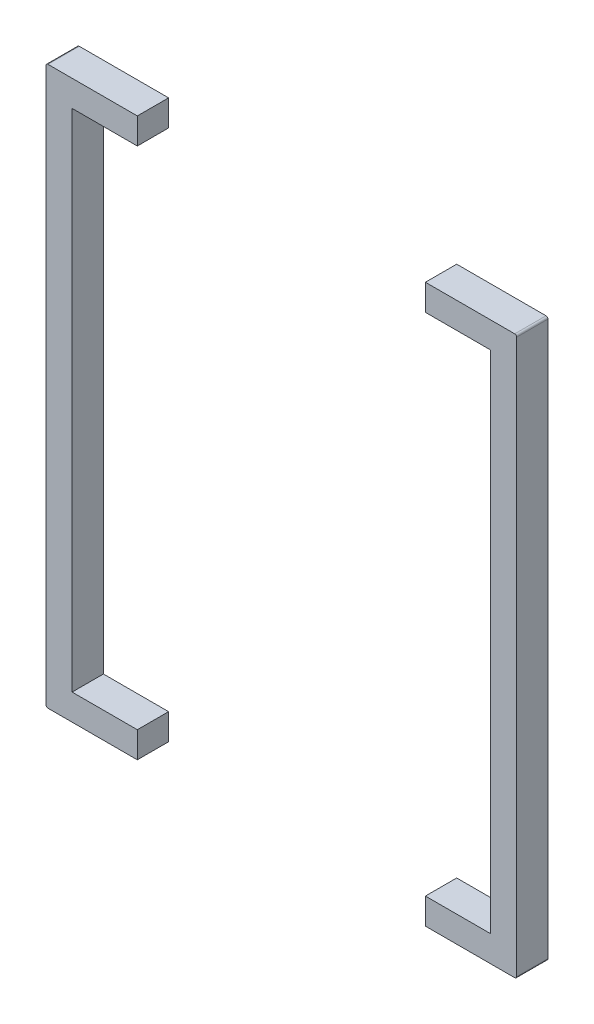
ISO-10303-21;
HEADER;
FILE_DESCRIPTION(('STEP AP214'),'2;1');
FILE_NAME('part.step','',(''),(''),'','','');
FILE_SCHEMA(('AUTOMOTIVE_DESIGN { 1 0 10303 214 1 1 1 1 }'));
ENDSEC;
DATA;
#1=APPLICATION_CONTEXT('core data for automotive mechanical design processes');
#2=APPLICATION_PROTOCOL_DEFINITION('international standard','automotive_design',2000,#1);
#3=PRODUCT_CONTEXT('',#1,'mechanical');
#4=PRODUCT('Part','Part','',(#3));
#5=PRODUCT_RELATED_PRODUCT_CATEGORY('part','',(#4));
#6=PRODUCT_DEFINITION_FORMATION('','',#4);
#7=PRODUCT_DEFINITION_CONTEXT('part definition',#1,'design');
#8=PRODUCT_DEFINITION('design','',#6,#7);
#9=PRODUCT_DEFINITION_SHAPE('','',#8);
#10=(LENGTH_UNIT() NAMED_UNIT(*) SI_UNIT(.MILLI.,.METRE.));
#11=(NAMED_UNIT(*) PLANE_ANGLE_UNIT() SI_UNIT($,.RADIAN.));
#12=(NAMED_UNIT(*) SI_UNIT($,.STERADIAN.) SOLID_ANGLE_UNIT());
#13=UNCERTAINTY_MEASURE_WITH_UNIT(LENGTH_MEASURE(1.E-05),#10,'distance_accuracy_value','');
#14=(GEOMETRIC_REPRESENTATION_CONTEXT(3) GLOBAL_UNCERTAINTY_ASSIGNED_CONTEXT((#13)) GLOBAL_UNIT_ASSIGNED_CONTEXT((#10,
#11,#12)) REPRESENTATION_CONTEXT('',''));
#15=CARTESIAN_POINT('',(0.,0.,0.));
#16=DIRECTION('',(0.,0.,1.));
#17=DIRECTION('',(1.,0.,0.));
#18=AXIS2_PLACEMENT_3D('',#15,#16,#17);
#19=CARTESIAN_POINT('',(-76.1520295904938,8.24310096287703,12.));
#20=DIRECTION('',(0.,1.,0.));
#21=DIRECTION('',(0.,0.,1.));
#22=AXIS2_PLACEMENT_3D('',#19,#20,#21);
#23=PLANE('',#22);
#24=DIRECTION('',(1.,0.,0.));
#25=VECTOR('',#24,1.);
#26=CARTESIAN_POINT('',(-76.1520295904938,8.24310096287703,12.));
#27=LINE('',#26,#25);
#28=CARTESIAN_POINT('',(69.3179704095062,8.24310096287703,12.));
#29=VERTEX_POINT('',#28);
#30=CARTESIAN_POINT('',(103.581370409506,8.24310096287703,12.));
#31=VERTEX_POINT('',#30);
#32=EDGE_CURVE('E124',#29,#31,#27,.T.);
#33=ORIENTED_EDGE('',*,*,#32,.F.);
#34=DIRECTION('',(0.,0.,1.));
#35=VECTOR('',#34,1.);
#36=CARTESIAN_POINT('',(69.3179704095062,8.24310096287703,12.));
#37=LINE('',#36,#35);
#38=CARTESIAN_POINT('',(69.3179704095062,8.24310096287703,0.));
#39=VERTEX_POINT('',#38);
#40=EDGE_CURVE('E12',#39,#29,#37,.T.);
#41=ORIENTED_EDGE('',*,*,#40,.F.);
#42=DIRECTION('',(1.,0.,0.));
#43=VECTOR('',#42,1.);
#44=CARTESIAN_POINT('',(-76.1520295904938,8.24310096287703,0.));
#45=LINE('',#44,#43);
#46=CARTESIAN_POINT('',(103.581370409506,8.24310096287703,0.));
#47=VERTEX_POINT('',#46);
#48=EDGE_CURVE('E122',#39,#47,#45,.T.);
#49=ORIENTED_EDGE('',*,*,#48,.T.);
#50=DIRECTION('',(0.,0.,-1.));
#51=VECTOR('',#50,1.);
#52=CARTESIAN_POINT('',(103.581370409506,8.24310096287703,12.));
#53=LINE('',#52,#51);
#54=EDGE_CURVE('E129',#47,#31,#53,.F.);
#55=ORIENTED_EDGE('',*,*,#54,.T.);
#56=EDGE_LOOP('',(#33,#41,#49,#55));
#57=FACE_BOUND('',#56,.T.);
#58=ADVANCED_FACE('F40',(#57),#23,.F.);
#59=CARTESIAN_POINT('',(-76.1520295904938,8.24310096287703,12.));
#60=DIRECTION('',(0.,0.,1.));
#61=DIRECTION('',(1.,0.,0.));
#62=AXIS2_PLACEMENT_3D('',#59,#60,#61);
#63=PLANE('',#62);
#64=DIRECTION('',(0.,-1.,0.));
#65=VECTOR('',#64,1.);
#66=CARTESIAN_POINT('',(69.3179704095062,222.084100962877,12.));
#67=LINE('',#66,#65);
#68=CARTESIAN_POINT('',(69.3179704095062,18.243100962877,12.));
#69=VERTEX_POINT('',#68);
#70=EDGE_CURVE('E56',#69,#29,#67,.T.);
#71=ORIENTED_EDGE('',*,*,#70,.T.);
#72=ORIENTED_EDGE('',*,*,#32,.T.);
#73=CARTESIAN_POINT('',(103.581370409506,8.97970096287704,12.));
#74=DIRECTION('',(0.,0.,1.));
#75=DIRECTION('',(1.,0.,0.));
#76=AXIS2_PLACEMENT_3D('',#73,#74,#75);
#77=CIRCLE('',#76,0.7366);
#78=CARTESIAN_POINT('',(104.317970409506,8.97970096287709,12.));
#79=VERTEX_POINT('',#78);
#80=EDGE_CURVE('E165',#31,#79,#77,.T.);
#81=ORIENTED_EDGE('',*,*,#80,.T.);
#82=DIRECTION('',(0.,1.,0.));
#83=VECTOR('',#82,1.);
#84=CARTESIAN_POINT('',(104.317970409506,222.083100962877,12.));
#85=LINE('',#84,#83);
#86=CARTESIAN_POINT('',(104.317970409506,221.346500962877,12.));
#87=VERTEX_POINT('',#86);
#88=EDGE_CURVE('E162',#79,#87,#85,.T.);
#89=ORIENTED_EDGE('',*,*,#88,.T.);
#90=CARTESIAN_POINT('',(103.581370409506,221.346500962877,12.));
#91=DIRECTION('',(0.,0.,1.));
#92=DIRECTION('',(1.,0.,0.));
#93=AXIS2_PLACEMENT_3D('',#90,#91,#92);
#94=CIRCLE('',#93,0.7366);
#95=CARTESIAN_POINT('',(103.581370409506,222.083100962877,12.));
#96=VERTEX_POINT('',#95);
#97=EDGE_CURVE('E164',#87,#96,#94,.T.);
#98=ORIENTED_EDGE('',*,*,#97,.T.);
#99=DIRECTION('',(-1.,0.,0.));
#100=VECTOR('',#99,1.);
#101=CARTESIAN_POINT('',(-76.1520295904938,222.083100962877,12.));
#102=LINE('',#101,#100);
#103=CARTESIAN_POINT('',(69.3179704095062,222.083100962877,12.));
#104=VERTEX_POINT('',#103);
#105=EDGE_CURVE('E179',#96,#104,#102,.T.);
#106=ORIENTED_EDGE('',*,*,#105,.T.);
#107=DIRECTION('',(0.,1.,0.));
#108=VECTOR('',#107,1.);
#109=CARTESIAN_POINT('',(69.3179704095062,8.24210096287703,12.));
#110=LINE('',#109,#108);
#111=CARTESIAN_POINT('',(69.3179704095062,212.083100962877,12.));
#112=VERTEX_POINT('',#111);
#113=EDGE_CURVE('E180',#112,#104,#110,.T.);
#114=ORIENTED_EDGE('',*,*,#113,.F.);
#115=DIRECTION('',(-1.,0.,0.));
#116=VECTOR('',#115,1.);
#117=CARTESIAN_POINT('',(-66.1520295904938,212.083100962877,12.));
#118=LINE('',#117,#116);
#119=CARTESIAN_POINT('',(94.3179704095062,212.083100962877,12.));
#120=VERTEX_POINT('',#119);
#121=EDGE_CURVE('E139',#120,#112,#118,.T.);
#122=ORIENTED_EDGE('',*,*,#121,.F.);
#123=DIRECTION('',(0.,1.,0.));
#124=VECTOR('',#123,1.);
#125=CARTESIAN_POINT('',(94.3179704095062,212.083100962877,12.));
#126=LINE('',#125,#124);
#127=CARTESIAN_POINT('',(94.3179704095062,18.243100962877,12.));
#128=VERTEX_POINT('',#127);
#129=EDGE_CURVE('E168',#128,#120,#126,.T.);
#130=ORIENTED_EDGE('',*,*,#129,.F.);
#131=DIRECTION('',(1.,0.,0.));
#132=VECTOR('',#131,1.);
#133=CARTESIAN_POINT('',(-66.1520295904938,18.243100962877,12.));
#134=LINE('',#133,#132);
#135=EDGE_CURVE('E138',#69,#128,#134,.T.);
#136=ORIENTED_EDGE('',*,*,#135,.F.);
#137=EDGE_LOOP('',(#71,#72,#81,#89,#98,#106,#114,#122,#130,#136));
#138=FACE_BOUND('',#137,.T.);
#139=ADVANCED_FACE('F205',(#138),#63,.T.);
#140=CARTESIAN_POINT('',(-76.1520295904938,8.24310096287703,0.));
#141=DIRECTION('',(0.,0.,1.));
#142=DIRECTION('',(1.,0.,0.));
#143=AXIS2_PLACEMENT_3D('',#140,#141,#142);
#144=PLANE('',#143);
#145=ORIENTED_EDGE('',*,*,#48,.F.);
#146=DIRECTION('',(0.,-1.,0.));
#147=VECTOR('',#146,1.);
#148=CARTESIAN_POINT('',(69.3179704095062,222.084100962877,0.));
#149=LINE('',#148,#147);
#150=CARTESIAN_POINT('',(69.3179704095062,18.243100962877,0.));
#151=VERTEX_POINT('',#150);
#152=EDGE_CURVE('E49',#151,#39,#149,.T.);
#153=ORIENTED_EDGE('',*,*,#152,.F.);
#154=DIRECTION('',(-1.,0.,0.));
#155=VECTOR('',#154,1.);
#156=CARTESIAN_POINT('',(-66.1520295904938,18.243100962877,0.));
#157=LINE('',#156,#155);
#158=CARTESIAN_POINT('',(94.3179704095062,18.243100962877,0.));
#159=VERTEX_POINT('',#158);
#160=EDGE_CURVE('E136',#159,#151,#157,.T.);
#161=ORIENTED_EDGE('',*,*,#160,.F.);
#162=DIRECTION('',(0.,-1.,0.));
#163=VECTOR('',#162,1.);
#164=CARTESIAN_POINT('',(94.3179704095062,212.083100962877,0.));
#165=LINE('',#164,#163);
#166=CARTESIAN_POINT('',(94.3179704095062,212.083100962877,0.));
#167=VERTEX_POINT('',#166);
#168=EDGE_CURVE('E169',#167,#159,#165,.T.);
#169=ORIENTED_EDGE('',*,*,#168,.F.);
#170=DIRECTION('',(1.,0.,0.));
#171=VECTOR('',#170,1.);
#172=CARTESIAN_POINT('',(-66.1520295904938,212.083100962877,0.));
#173=LINE('',#172,#171);
#174=CARTESIAN_POINT('',(69.3179704095062,212.083100962877,0.));
#175=VERTEX_POINT('',#174);
#176=EDGE_CURVE('E43',#175,#167,#173,.T.);
#177=ORIENTED_EDGE('',*,*,#176,.F.);
#178=DIRECTION('',(0.,1.,0.));
#179=VECTOR('',#178,1.);
#180=CARTESIAN_POINT('',(69.3179704095062,8.24210096287703,0.));
#181=LINE('',#180,#179);
#182=CARTESIAN_POINT('',(69.3179704095062,222.083100962877,0.));
#183=VERTEX_POINT('',#182);
#184=EDGE_CURVE('E176',#175,#183,#181,.T.);
#185=ORIENTED_EDGE('',*,*,#184,.T.);
#186=DIRECTION('',(-1.,0.,0.));
#187=VECTOR('',#186,1.);
#188=CARTESIAN_POINT('',(-76.1520295904938,222.083100962877,0.));
#189=LINE('',#188,#187);
#190=CARTESIAN_POINT('',(103.581370409506,222.083100962877,0.));
#191=VERTEX_POINT('',#190);
#192=EDGE_CURVE('E134',#191,#183,#189,.T.);
#193=ORIENTED_EDGE('',*,*,#192,.F.);
#194=CARTESIAN_POINT('',(103.581370409506,221.346500962877,0.));
#195=DIRECTION('',(0.,0.,1.));
#196=DIRECTION('',(1.,0.,0.));
#197=AXIS2_PLACEMENT_3D('',#194,#195,#196);
#198=CIRCLE('',#197,0.7366);
#199=CARTESIAN_POINT('',(104.317970409506,221.346500962877,0.));
#200=VERTEX_POINT('',#199);
#201=EDGE_CURVE('E156',#191,#200,#198,.F.);
#202=ORIENTED_EDGE('',*,*,#201,.T.);
#203=DIRECTION('',(0.,1.,0.));
#204=VECTOR('',#203,1.);
#205=CARTESIAN_POINT('',(104.317970409506,222.083100962877,0.));
#206=LINE('',#205,#204);
#207=CARTESIAN_POINT('',(104.317970409506,8.97970096287709,0.));
#208=VERTEX_POINT('',#207);
#209=EDGE_CURVE('E158',#208,#200,#206,.T.);
#210=ORIENTED_EDGE('',*,*,#209,.F.);
#211=CARTESIAN_POINT('',(103.581370409506,8.97970096287704,0.));
#212=DIRECTION('',(0.,0.,1.));
#213=DIRECTION('',(1.,0.,0.));
#214=AXIS2_PLACEMENT_3D('',#211,#212,#213);
#215=CIRCLE('',#214,0.7366);
#216=EDGE_CURVE('E127',#208,#47,#215,.F.);
#217=ORIENTED_EDGE('',*,*,#216,.T.);
#218=EDGE_LOOP('',(#145,#153,#161,#169,#177,#185,#193,#202,#210,#217));
#219=FACE_BOUND('',#218,.T.);
#220=ADVANCED_FACE('F125',(#219),#144,.F.);
#221=CARTESIAN_POINT('',(-66.1520295904938,18.243100962877,-0.000999999999999265));
#222=DIRECTION('',(0.,-1.,0.));
#223=DIRECTION('',(0.,0.,-1.));
#224=AXIS2_PLACEMENT_3D('',#221,#222,#223);
#225=PLANE('',#224);
#226=ORIENTED_EDGE('',*,*,#160,.T.);
#227=DIRECTION('',(0.,0.,-1.));
#228=VECTOR('',#227,1.);
#229=CARTESIAN_POINT('',(69.3179704095062,18.243100962877,12.));
#230=LINE('',#229,#228);
#231=EDGE_CURVE('E113',#69,#151,#230,.T.);
#232=ORIENTED_EDGE('',*,*,#231,.F.);
#233=ORIENTED_EDGE('',*,*,#135,.T.);
#234=DIRECTION('',(0.,0.,1.));
#235=VECTOR('',#234,1.);
#236=CARTESIAN_POINT('',(94.3179704095062,18.243100962877,-0.000999999999999265));
#237=LINE('',#236,#235);
#238=EDGE_CURVE('E166',#159,#128,#237,.T.);
#239=ORIENTED_EDGE('',*,*,#238,.F.);
#240=EDGE_LOOP('',(#226,#232,#233,#239));
#241=FACE_BOUND('',#240,.T.);
#242=ADVANCED_FACE('F220',(#241),#225,.F.);
#243=CARTESIAN_POINT('',(-76.1520295904938,222.083100962877,12.));
#244=DIRECTION('',(0.,-1.,0.));
#245=DIRECTION('',(0.,0.,-1.));
#246=AXIS2_PLACEMENT_3D('',#243,#244,#245);
#247=PLANE('',#246);
#248=ORIENTED_EDGE('',*,*,#192,.T.);
#249=DIRECTION('',(0.,0.,-1.));
#250=VECTOR('',#249,1.);
#251=CARTESIAN_POINT('',(69.3179704095062,222.083100962877,0.));
#252=LINE('',#251,#250);
#253=EDGE_CURVE('E182',#104,#183,#252,.T.);
#254=ORIENTED_EDGE('',*,*,#253,.F.);
#255=ORIENTED_EDGE('',*,*,#105,.F.);
#256=DIRECTION('',(0.,0.,-1.));
#257=VECTOR('',#256,1.);
#258=CARTESIAN_POINT('',(103.581370409506,222.083100962877,12.));
#259=LINE('',#258,#257);
#260=EDGE_CURVE('E141',#96,#191,#259,.T.);
#261=ORIENTED_EDGE('',*,*,#260,.T.);
#262=EDGE_LOOP('',(#248,#254,#255,#261));
#263=FACE_BOUND('',#262,.T.);
#264=ADVANCED_FACE('F207',(#263),#247,.F.);
#265=CARTESIAN_POINT('',(-66.1520295904938,212.083100962877,-0.000999999999999265));
#266=DIRECTION('',(0.,1.,0.));
#267=DIRECTION('',(0.,0.,1.));
#268=AXIS2_PLACEMENT_3D('',#265,#266,#267);
#269=PLANE('',#268);
#270=ORIENTED_EDGE('',*,*,#121,.T.);
#271=DIRECTION('',(0.,0.,1.));
#272=VECTOR('',#271,1.);
#273=CARTESIAN_POINT('',(69.3179704095062,212.083100962877,0.));
#274=LINE('',#273,#272);
#275=EDGE_CURVE('E174',#175,#112,#274,.T.);
#276=ORIENTED_EDGE('',*,*,#275,.F.);
#277=ORIENTED_EDGE('',*,*,#176,.T.);
#278=DIRECTION('',(0.,0.,1.));
#279=VECTOR('',#278,1.);
#280=CARTESIAN_POINT('',(94.3179704095062,212.083100962877,-0.000999999999999265));
#281=LINE('',#280,#279);
#282=EDGE_CURVE('E170',#167,#120,#281,.T.);
#283=ORIENTED_EDGE('',*,*,#282,.T.);
#284=EDGE_LOOP('',(#270,#276,#277,#283));
#285=FACE_BOUND('',#284,.T.);
#286=ADVANCED_FACE('F215',(#285),#269,.F.);
#287=CARTESIAN_POINT('',(104.317970409506,222.083100962877,12.));
#288=DIRECTION('',(-1.,0.,0.));
#289=DIRECTION('',(0.,-1.,0.));
#290=AXIS2_PLACEMENT_3D('',#287,#288,#289);
#291=PLANE('',#290);
#292=ORIENTED_EDGE('',*,*,#88,.F.);
#293=DIRECTION('',(0.,0.,-1.));
#294=VECTOR('',#293,1.);
#295=CARTESIAN_POINT('',(104.317970409506,8.97970096287704,12.));
#296=LINE('',#295,#294);
#297=EDGE_CURVE('E161',#79,#208,#296,.T.);
#298=ORIENTED_EDGE('',*,*,#297,.T.);
#299=ORIENTED_EDGE('',*,*,#209,.T.);
#300=DIRECTION('',(0.,0.,-1.));
#301=VECTOR('',#300,1.);
#302=CARTESIAN_POINT('',(104.317970409506,221.346500962877,12.));
#303=LINE('',#302,#301);
#304=EDGE_CURVE('E160',#200,#87,#303,.F.);
#305=ORIENTED_EDGE('',*,*,#304,.T.);
#306=EDGE_LOOP('',(#292,#298,#299,#305));
#307=FACE_BOUND('',#306,.T.);
#308=ADVANCED_FACE('F200',(#307),#291,.F.);
#309=CARTESIAN_POINT('',(103.581370409506,221.346500962877,12.));
#310=DIRECTION('',(0.,0.,-1.));
#311=DIRECTION('',(-1.,0.,0.));
#312=AXIS2_PLACEMENT_3D('',#309,#310,#311);
#313=CYLINDRICAL_SURFACE('',#312,0.7366);
#314=ORIENTED_EDGE('',*,*,#97,.F.);
#315=ORIENTED_EDGE('',*,*,#304,.F.);
#316=ORIENTED_EDGE('',*,*,#201,.F.);
#317=ORIENTED_EDGE('',*,*,#260,.F.);
#318=EDGE_LOOP('',(#314,#315,#316,#317));
#319=FACE_BOUND('',#318,.T.);
#320=ADVANCED_FACE('F204',(#319),#313,.T.);
#321=CARTESIAN_POINT('',(103.581370409506,8.97970096287704,12.));
#322=DIRECTION('',(0.,0.,-1.));
#323=DIRECTION('',(-1.,0.,0.));
#324=AXIS2_PLACEMENT_3D('',#321,#322,#323);
#325=CYLINDRICAL_SURFACE('',#324,0.7366);
#326=ORIENTED_EDGE('',*,*,#80,.F.);
#327=ORIENTED_EDGE('',*,*,#54,.F.);
#328=ORIENTED_EDGE('',*,*,#216,.F.);
#329=ORIENTED_EDGE('',*,*,#297,.F.);
#330=EDGE_LOOP('',(#326,#327,#328,#329));
#331=FACE_BOUND('',#330,.T.);
#332=ADVANCED_FACE('F274',(#331),#325,.T.);
#333=CARTESIAN_POINT('',(94.3179704095062,212.083100962877,-0.000999999999999265));
#334=DIRECTION('',(1.,0.,0.));
#335=DIRECTION('',(0.,1.,0.));
#336=AXIS2_PLACEMENT_3D('',#333,#334,#335);
#337=PLANE('',#336);
#338=ORIENTED_EDGE('',*,*,#168,.T.);
#339=ORIENTED_EDGE('',*,*,#238,.T.);
#340=ORIENTED_EDGE('',*,*,#129,.T.);
#341=ORIENTED_EDGE('',*,*,#282,.F.);
#342=EDGE_LOOP('',(#338,#339,#340,#341));
#343=FACE_BOUND('',#342,.T.);
#344=ADVANCED_FACE('F217',(#343),#337,.F.);
#345=CARTESIAN_POINT('',(69.3179704095062,8.24210096287703,0.));
#346=DIRECTION('',(1.,0.,0.));
#347=DIRECTION('',(0.,0.,-1.));
#348=AXIS2_PLACEMENT_3D('',#345,#346,#347);
#349=PLANE('',#348);
#350=ORIENTED_EDGE('',*,*,#275,.T.);
#351=ORIENTED_EDGE('',*,*,#113,.T.);
#352=ORIENTED_EDGE('',*,*,#253,.T.);
#353=ORIENTED_EDGE('',*,*,#184,.F.);
#354=EDGE_LOOP('',(#350,#351,#352,#353));
#355=FACE_BOUND('',#354,.T.);
#356=ADVANCED_FACE('F209',(#355),#349,.F.);
#357=CARTESIAN_POINT('',(69.3179704095062,222.084100962877,12.));
#358=DIRECTION('',(1.,0.,0.));
#359=DIRECTION('',(0.,0.,-1.));
#360=AXIS2_PLACEMENT_3D('',#357,#358,#359);
#361=PLANE('',#360);
#362=ORIENTED_EDGE('',*,*,#231,.T.);
#363=ORIENTED_EDGE('',*,*,#152,.T.);
#364=ORIENTED_EDGE('',*,*,#40,.T.);
#365=ORIENTED_EDGE('',*,*,#70,.F.);
#366=EDGE_LOOP('',(#362,#363,#364,#365));
#367=FACE_BOUND('',#366,.T.);
#368=ADVANCED_FACE('F112',(#367),#361,.F.);
#369=CLOSED_SHELL('',(#58,#139,#220,#242,#264,#286,#308,#320,#332,#344,#356,#368));
#370=MANIFOLD_SOLID_BREP('B2',#369);
#371=CARTESIAN_POINT('',(-66.1520295904938,212.083100962877,-0.000999999999999265));
#372=DIRECTION('',(0.,1.,0.));
#373=DIRECTION('',(0.,0.,1.));
#374=AXIS2_PLACEMENT_3D('',#371,#372,#373);
#375=PLANE('',#374);
#376=DIRECTION('',(1.,0.,0.));
#377=VECTOR('',#376,1.);
#378=CARTESIAN_POINT('',(-66.1520295904938,212.083100962877,0.));
#379=LINE('',#378,#377);
#380=CARTESIAN_POINT('',(-66.1520295904938,212.083100962877,0.));
#381=VERTEX_POINT('',#380);
#382=CARTESIAN_POINT('',(-41.1520295904938,212.083100962877,0.));
#383=VERTEX_POINT('',#382);
#384=EDGE_CURVE('E473',#381,#383,#379,.T.);
#385=ORIENTED_EDGE('',*,*,#384,.T.);
#386=DIRECTION('',(0.,0.,-1.));
#387=VECTOR('',#386,1.);
#388=CARTESIAN_POINT('',(-41.1520295904938,212.083100962877,0.));
#389=LINE('',#388,#387);
#390=CARTESIAN_POINT('',(-41.1520295904938,212.083100962877,12.));
#391=VERTEX_POINT('',#390);
#392=EDGE_CURVE('E464',#391,#383,#389,.T.);
#393=ORIENTED_EDGE('',*,*,#392,.F.);
#394=DIRECTION('',(-1.,0.,0.));
#395=VECTOR('',#394,1.);
#396=CARTESIAN_POINT('',(-66.1520295904938,212.083100962877,12.));
#397=LINE('',#396,#395);
#398=CARTESIAN_POINT('',(-66.1520295904938,212.083100962877,12.));
#399=VERTEX_POINT('',#398);
#400=EDGE_CURVE('E484',#391,#399,#397,.T.);
#401=ORIENTED_EDGE('',*,*,#400,.T.);
#402=DIRECTION('',(0.,0.,1.));
#403=VECTOR('',#402,1.);
#404=CARTESIAN_POINT('',(-66.1520295904938,212.083100962877,-0.000999999999999265));
#405=LINE('',#404,#403);
#406=EDGE_CURVE('E487',#381,#399,#405,.T.);
#407=ORIENTED_EDGE('',*,*,#406,.F.);
#408=EDGE_LOOP('',(#385,#393,#401,#407));
#409=FACE_BOUND('',#408,.T.);
#410=ADVANCED_FACE('F319',(#409),#375,.F.);
#411=CARTESIAN_POINT('',(-41.1520295904938,8.24210096287703,0.));
#412=DIRECTION('',(-1.,0.,0.));
#413=DIRECTION('',(0.,0.,1.));
#414=AXIS2_PLACEMENT_3D('',#411,#412,#413);
#415=PLANE('',#414);
#416=ORIENTED_EDGE('',*,*,#392,.T.);
#417=DIRECTION('',(0.,1.,0.));
#418=VECTOR('',#417,1.);
#419=CARTESIAN_POINT('',(-41.1520295904938,8.24210096287703,0.));
#420=LINE('',#419,#418);
#421=CARTESIAN_POINT('',(-41.1520295904938,222.083100962877,0.));
#422=VERTEX_POINT('',#421);
#423=EDGE_CURVE('E471',#383,#422,#420,.T.);
#424=ORIENTED_EDGE('',*,*,#423,.T.);
#425=DIRECTION('',(0.,0.,1.));
#426=VECTOR('',#425,1.);
#427=CARTESIAN_POINT('',(-41.1520295904938,222.083100962877,0.));
#428=LINE('',#427,#426);
#429=CARTESIAN_POINT('',(-41.1520295904938,222.083100962877,12.));
#430=VERTEX_POINT('',#429);
#431=EDGE_CURVE('E466',#422,#430,#428,.T.);
#432=ORIENTED_EDGE('',*,*,#431,.T.);
#433=DIRECTION('',(0.,1.,0.));
#434=VECTOR('',#433,1.);
#435=CARTESIAN_POINT('',(-41.1520295904938,8.24210096287703,12.));
#436=LINE('',#435,#434);
#437=EDGE_CURVE('E342',#391,#430,#436,.T.);
#438=ORIENTED_EDGE('',*,*,#437,.F.);
#439=EDGE_LOOP('',(#416,#424,#432,#438));
#440=FACE_BOUND('',#439,.T.);
#441=ADVANCED_FACE('F501',(#440),#415,.F.);
#442=CARTESIAN_POINT('',(-76.1520295904938,222.083100962877,12.));
#443=DIRECTION('',(0.,-1.,0.));
#444=DIRECTION('',(0.,0.,-1.));
#445=AXIS2_PLACEMENT_3D('',#442,#443,#444);
#446=PLANE('',#445);
#447=DIRECTION('',(-1.,0.,0.));
#448=VECTOR('',#447,1.);
#449=CARTESIAN_POINT('',(-76.1520295904938,222.083100962877,12.));
#450=LINE('',#449,#448);
#451=CARTESIAN_POINT('',(-75.4154295904938,222.083100962877,12.));
#452=VERTEX_POINT('',#451);
#453=EDGE_CURVE('E416',#430,#452,#450,.T.);
#454=ORIENTED_EDGE('',*,*,#453,.F.);
#455=ORIENTED_EDGE('',*,*,#431,.F.);
#456=DIRECTION('',(-1.,0.,0.));
#457=VECTOR('',#456,1.);
#458=CARTESIAN_POINT('',(-76.1520295904938,222.083100962877,0.));
#459=LINE('',#458,#457);
#460=CARTESIAN_POINT('',(-75.4154295904938,222.083100962877,0.));
#461=VERTEX_POINT('',#460);
#462=EDGE_CURVE('E421',#422,#461,#459,.T.);
#463=ORIENTED_EDGE('',*,*,#462,.T.);
#464=DIRECTION('',(0.,0.,-1.));
#465=VECTOR('',#464,1.);
#466=CARTESIAN_POINT('',(-75.4154295904938,222.083100962877,12.));
#467=LINE('',#466,#465);
#468=EDGE_CURVE('E327',#461,#452,#467,.F.);
#469=ORIENTED_EDGE('',*,*,#468,.T.);
#470=EDGE_LOOP('',(#454,#455,#463,#469));
#471=FACE_BOUND('',#470,.T.);
#472=ADVANCED_FACE('F448',(#471),#446,.F.);
#473=CARTESIAN_POINT('',(-75.4154295904938,221.346500962877,12.));
#474=DIRECTION('',(0.,0.,-1.));
#475=DIRECTION('',(-1.,0.,0.));
#476=AXIS2_PLACEMENT_3D('',#473,#474,#475);
#477=CYLINDRICAL_SURFACE('',#476,0.7366);
#478=CARTESIAN_POINT('',(-75.4154295904938,221.346500962877,12.));
#479=DIRECTION('',(0.,0.,1.));
#480=DIRECTION('',(1.,0.,0.));
#481=AXIS2_PLACEMENT_3D('',#478,#479,#480);
#482=CIRCLE('',#481,0.7366);
#483=CARTESIAN_POINT('',(-76.1520295904938,221.346500962877,12.));
#484=VERTEX_POINT('',#483);
#485=EDGE_CURVE('E38',#452,#484,#482,.T.);
#486=ORIENTED_EDGE('',*,*,#485,.F.);
#487=ORIENTED_EDGE('',*,*,#468,.F.);
#488=CARTESIAN_POINT('',(-75.4154295904938,221.346500962877,0.));
#489=DIRECTION('',(0.,0.,1.));
#490=DIRECTION('',(1.,0.,0.));
#491=AXIS2_PLACEMENT_3D('',#488,#489,#490);
#492=CIRCLE('',#491,0.7366);
#493=CARTESIAN_POINT('',(-76.1520295904938,221.346500962877,0.));
#494=VERTEX_POINT('',#493);
#495=EDGE_CURVE('E441',#494,#461,#492,.F.);
#496=ORIENTED_EDGE('',*,*,#495,.F.);
#497=DIRECTION('',(0.,0.,-1.));
#498=VECTOR('',#497,1.);
#499=CARTESIAN_POINT('',(-76.1520295904938,221.346500962877,12.));
#500=LINE('',#499,#498);
#501=EDGE_CURVE('E438',#484,#494,#500,.T.);
#502=ORIENTED_EDGE('',*,*,#501,.F.);
#503=EDGE_LOOP('',(#486,#487,#496,#502));
#504=FACE_BOUND('',#503,.T.);
#505=ADVANCED_FACE('F321',(#504),#477,.T.);
#506=CARTESIAN_POINT('',(-76.1520295904938,222.083100962877,12.));
#507=DIRECTION('',(1.,0.,0.));
#508=DIRECTION('',(0.,1.,0.));
#509=AXIS2_PLACEMENT_3D('',#506,#507,#508);
#510=PLANE('',#509);
#511=DIRECTION('',(0.,-1.,0.));
#512=VECTOR('',#511,1.);
#513=CARTESIAN_POINT('',(-76.1520295904938,222.083100962877,12.));
#514=LINE('',#513,#512);
#515=CARTESIAN_POINT('',(-76.1520295904938,8.97970096287709,12.));
#516=VERTEX_POINT('',#515);
#517=EDGE_CURVE('E417',#484,#516,#514,.T.);
#518=ORIENTED_EDGE('',*,*,#517,.F.);
#519=ORIENTED_EDGE('',*,*,#501,.T.);
#520=DIRECTION('',(0.,-1.,0.));
#521=VECTOR('',#520,1.);
#522=CARTESIAN_POINT('',(-76.1520295904938,222.083100962877,0.));
#523=LINE('',#522,#521);
#524=CARTESIAN_POINT('',(-76.1520295904938,8.97970096287709,0.));
#525=VERTEX_POINT('',#524);
#526=EDGE_CURVE('E425',#494,#525,#523,.T.);
#527=ORIENTED_EDGE('',*,*,#526,.T.);
#528=DIRECTION('',(0.,0.,-1.));
#529=VECTOR('',#528,1.);
#530=CARTESIAN_POINT('',(-76.1520295904938,8.97970096287704,12.));
#531=LINE('',#530,#529);
#532=EDGE_CURVE('E434',#525,#516,#531,.F.);
#533=ORIENTED_EDGE('',*,*,#532,.T.);
#534=EDGE_LOOP('',(#518,#519,#527,#533));
#535=FACE_BOUND('',#534,.T.);
#536=ADVANCED_FACE('F455',(#535),#510,.F.);
#537=CARTESIAN_POINT('',(-75.4154295904938,8.97970096287703,12.));
#538=DIRECTION('',(0.,0.,-1.));
#539=DIRECTION('',(-1.,0.,0.));
#540=AXIS2_PLACEMENT_3D('',#537,#538,#539);
#541=CYLINDRICAL_SURFACE('',#540,0.7366);
#542=CARTESIAN_POINT('',(-75.4154295904938,8.97970096287703,12.));
#543=DIRECTION('',(0.,0.,1.));
#544=DIRECTION('',(1.,0.,0.));
#545=AXIS2_PLACEMENT_3D('',#542,#543,#544);
#546=CIRCLE('',#545,0.7366);
#547=CARTESIAN_POINT('',(-75.4154295904938,8.24310096287703,12.));
#548=VERTEX_POINT('',#547);
#549=EDGE_CURVE('E415',#516,#548,#546,.T.);
#550=ORIENTED_EDGE('',*,*,#549,.F.);
#551=ORIENTED_EDGE('',*,*,#532,.F.);
#552=CARTESIAN_POINT('',(-75.4154295904938,8.97970096287703,0.));
#553=DIRECTION('',(0.,0.,1.));
#554=DIRECTION('',(1.,0.,0.));
#555=AXIS2_PLACEMENT_3D('',#552,#553,#554);
#556=CIRCLE('',#555,0.7366);
#557=CARTESIAN_POINT('',(-75.4154295904938,8.24310096287703,0.));
#558=VERTEX_POINT('',#557);
#559=EDGE_CURVE('E431',#558,#525,#556,.F.);
#560=ORIENTED_EDGE('',*,*,#559,.F.);
#561=DIRECTION('',(0.,0.,-1.));
#562=VECTOR('',#561,1.);
#563=CARTESIAN_POINT('',(-75.4154295904938,8.24310096287703,12.));
#564=LINE('',#563,#562);
#565=EDGE_CURVE('E419',#548,#558,#564,.T.);
#566=ORIENTED_EDGE('',*,*,#565,.F.);
#567=EDGE_LOOP('',(#550,#551,#560,#566));
#568=FACE_BOUND('',#567,.T.);
#569=ADVANCED_FACE('F459',(#568),#541,.T.);
#570=CARTESIAN_POINT('',(-66.1520295904938,212.083100962877,-0.000999999999999265));
#571=DIRECTION('',(-1.,0.,0.));
#572=DIRECTION('',(0.,-1.,0.));
#573=AXIS2_PLACEMENT_3D('',#570,#571,#572);
#574=PLANE('',#573);
#575=DIRECTION('',(0.,1.,0.));
#576=VECTOR('',#575,1.);
#577=CARTESIAN_POINT('',(-66.1520295904938,212.083100962877,0.));
#578=LINE('',#577,#576);
#579=CARTESIAN_POINT('',(-66.1520295904938,18.243100962877,0.));
#580=VERTEX_POINT('',#579);
#581=EDGE_CURVE('E477',#580,#381,#578,.T.);
#582=ORIENTED_EDGE('',*,*,#581,.T.);
#583=ORIENTED_EDGE('',*,*,#406,.T.);
#584=DIRECTION('',(0.,-1.,0.));
#585=VECTOR('',#584,1.);
#586=CARTESIAN_POINT('',(-66.1520295904938,212.083100962877,12.));
#587=LINE('',#586,#585);
#588=CARTESIAN_POINT('',(-66.1520295904938,18.243100962877,12.));
#589=VERTEX_POINT('',#588);
#590=EDGE_CURVE('E480',#399,#589,#587,.T.);
#591=ORIENTED_EDGE('',*,*,#590,.T.);
#592=DIRECTION('',(0.,0.,1.));
#593=VECTOR('',#592,1.);
#594=CARTESIAN_POINT('',(-66.1520295904938,18.243100962877,-0.000999999999999265));
#595=LINE('',#594,#593);
#596=EDGE_CURVE('E486',#580,#589,#595,.T.);
#597=ORIENTED_EDGE('',*,*,#596,.F.);
#598=EDGE_LOOP('',(#582,#583,#591,#597));
#599=FACE_BOUND('',#598,.T.);
#600=ADVANCED_FACE('F495',(#599),#574,.F.);
#601=CARTESIAN_POINT('',(-66.1520295904938,18.243100962877,-0.000999999999999265));
#602=DIRECTION('',(0.,-1.,0.));
#603=DIRECTION('',(0.,0.,-1.));
#604=AXIS2_PLACEMENT_3D('',#601,#602,#603);
#605=PLANE('',#604);
#606=DIRECTION('',(1.,0.,0.));
#607=VECTOR('',#606,1.);
#608=CARTESIAN_POINT('',(-66.1520295904938,18.243100962877,12.));
#609=LINE('',#608,#607);
#610=CARTESIAN_POINT('',(-41.1520295904938,18.243100962877,12.));
#611=VERTEX_POINT('',#610);
#612=EDGE_CURVE('E482',#589,#611,#609,.T.);
#613=ORIENTED_EDGE('',*,*,#612,.T.);
#614=DIRECTION('',(0.,0.,1.));
#615=VECTOR('',#614,1.);
#616=CARTESIAN_POINT('',(-41.1520295904938,18.243100962877,12.));
#617=LINE('',#616,#615);
#618=CARTESIAN_POINT('',(-41.1520295904938,18.243100962877,0.));
#619=VERTEX_POINT('',#618);
#620=EDGE_CURVE('E397',#619,#611,#617,.T.);
#621=ORIENTED_EDGE('',*,*,#620,.F.);
#622=DIRECTION('',(-1.,0.,0.));
#623=VECTOR('',#622,1.);
#624=CARTESIAN_POINT('',(-66.1520295904938,18.243100962877,0.));
#625=LINE('',#624,#623);
#626=EDGE_CURVE('E427',#619,#580,#625,.T.);
#627=ORIENTED_EDGE('',*,*,#626,.T.);
#628=ORIENTED_EDGE('',*,*,#596,.T.);
#629=EDGE_LOOP('',(#613,#621,#627,#628));
#630=FACE_BOUND('',#629,.T.);
#631=ADVANCED_FACE('F493',(#630),#605,.F.);
#632=CARTESIAN_POINT('',(-76.1520295904938,8.24310096287703,0.));
#633=DIRECTION('',(0.,0.,1.));
#634=DIRECTION('',(1.,0.,0.));
#635=AXIS2_PLACEMENT_3D('',#632,#633,#634);
#636=PLANE('',#635);
#637=ORIENTED_EDGE('',*,*,#626,.F.);
#638=DIRECTION('',(0.,-1.,0.));
#639=VECTOR('',#638,1.);
#640=CARTESIAN_POINT('',(-41.1520295904938,222.084100962877,0.));
#641=LINE('',#640,#639);
#642=CARTESIAN_POINT('',(-41.1520295904938,8.24310096287703,0.));
#643=VERTEX_POINT('',#642);
#644=EDGE_CURVE('E334',#619,#643,#641,.T.);
#645=ORIENTED_EDGE('',*,*,#644,.T.);
#646=DIRECTION('',(1.,0.,0.));
#647=VECTOR('',#646,1.);
#648=CARTESIAN_POINT('',(-76.1520295904938,8.24310096287703,0.));
#649=LINE('',#648,#647);
#650=EDGE_CURVE('E411',#558,#643,#649,.T.);
#651=ORIENTED_EDGE('',*,*,#650,.F.);
#652=ORIENTED_EDGE('',*,*,#559,.T.);
#653=ORIENTED_EDGE('',*,*,#526,.F.);
#654=ORIENTED_EDGE('',*,*,#495,.T.);
#655=ORIENTED_EDGE('',*,*,#462,.F.);
#656=ORIENTED_EDGE('',*,*,#423,.F.);
#657=ORIENTED_EDGE('',*,*,#384,.F.);
#658=ORIENTED_EDGE('',*,*,#581,.F.);
#659=EDGE_LOOP('',(#637,#645,#651,#652,#653,#654,#655,#656,#657,#658));
#660=FACE_BOUND('',#659,.T.);
#661=ADVANCED_FACE('F462',(#660),#636,.F.);
#662=CARTESIAN_POINT('',(-76.1520295904938,8.24310096287703,12.));
#663=DIRECTION('',(0.,0.,1.));
#664=DIRECTION('',(1.,0.,0.));
#665=AXIS2_PLACEMENT_3D('',#662,#663,#664);
#666=PLANE('',#665);
#667=DIRECTION('',(0.,-1.,0.));
#668=VECTOR('',#667,1.);
#669=CARTESIAN_POINT('',(-41.1520295904938,222.084100962877,12.));
#670=LINE('',#669,#668);
#671=CARTESIAN_POINT('',(-41.1520295904938,8.24310096287703,12.));
#672=VERTEX_POINT('',#671);
#673=EDGE_CURVE('E393',#611,#672,#670,.T.);
#674=ORIENTED_EDGE('',*,*,#673,.F.);
#675=ORIENTED_EDGE('',*,*,#612,.F.);
#676=ORIENTED_EDGE('',*,*,#590,.F.);
#677=ORIENTED_EDGE('',*,*,#400,.F.);
#678=ORIENTED_EDGE('',*,*,#437,.T.);
#679=ORIENTED_EDGE('',*,*,#453,.T.);
#680=ORIENTED_EDGE('',*,*,#485,.T.);
#681=ORIENTED_EDGE('',*,*,#517,.T.);
#682=ORIENTED_EDGE('',*,*,#549,.T.);
#683=DIRECTION('',(1.,0.,0.));
#684=VECTOR('',#683,1.);
#685=CARTESIAN_POINT('',(-76.1520295904938,8.24310096287703,12.));
#686=LINE('',#685,#684);
#687=EDGE_CURVE('E408',#548,#672,#686,.T.);
#688=ORIENTED_EDGE('',*,*,#687,.T.);
#689=EDGE_LOOP('',(#674,#675,#676,#677,#678,#679,#680,#681,#682,#688));
#690=FACE_BOUND('',#689,.T.);
#691=ADVANCED_FACE('F413',(#690),#666,.T.);
#692=CARTESIAN_POINT('',(-76.1520295904938,8.24310096287703,12.));
#693=DIRECTION('',(0.,1.,0.));
#694=DIRECTION('',(0.,0.,1.));
#695=AXIS2_PLACEMENT_3D('',#692,#693,#694);
#696=PLANE('',#695);
#697=ORIENTED_EDGE('',*,*,#650,.T.);
#698=DIRECTION('',(0.,0.,-1.));
#699=VECTOR('',#698,1.);
#700=CARTESIAN_POINT('',(-41.1520295904938,8.24310096287703,12.));
#701=LINE('',#700,#699);
#702=EDGE_CURVE('E396',#672,#643,#701,.T.);
#703=ORIENTED_EDGE('',*,*,#702,.F.);
#704=ORIENTED_EDGE('',*,*,#687,.F.);
#705=ORIENTED_EDGE('',*,*,#565,.T.);
#706=EDGE_LOOP('',(#697,#703,#704,#705));
#707=FACE_BOUND('',#706,.T.);
#708=ADVANCED_FACE('F406',(#707),#696,.F.);
#709=CARTESIAN_POINT('',(-41.1520295904938,222.084100962877,12.));
#710=DIRECTION('',(-1.,0.,0.));
#711=DIRECTION('',(0.,0.,1.));
#712=AXIS2_PLACEMENT_3D('',#709,#710,#711);
#713=PLANE('',#712);
#714=ORIENTED_EDGE('',*,*,#620,.T.);
#715=ORIENTED_EDGE('',*,*,#673,.T.);
#716=ORIENTED_EDGE('',*,*,#702,.T.);
#717=ORIENTED_EDGE('',*,*,#644,.F.);
#718=EDGE_LOOP('',(#714,#715,#716,#717));
#719=FACE_BOUND('',#718,.T.);
#720=ADVANCED_FACE('F395',(#719),#713,.F.);
#721=CLOSED_SHELL('',(#410,#441,#472,#505,#536,#569,#600,#631,#661,#691,#708,#720));
#722=MANIFOLD_SOLID_BREP('B6',#721);
#723=ADVANCED_BREP_SHAPE_REPRESENTATION('',(#18,#370,#722),#14);
#724=SHAPE_DEFINITION_REPRESENTATION(#9,#723);
ENDSEC;
END-ISO-10303-21;
